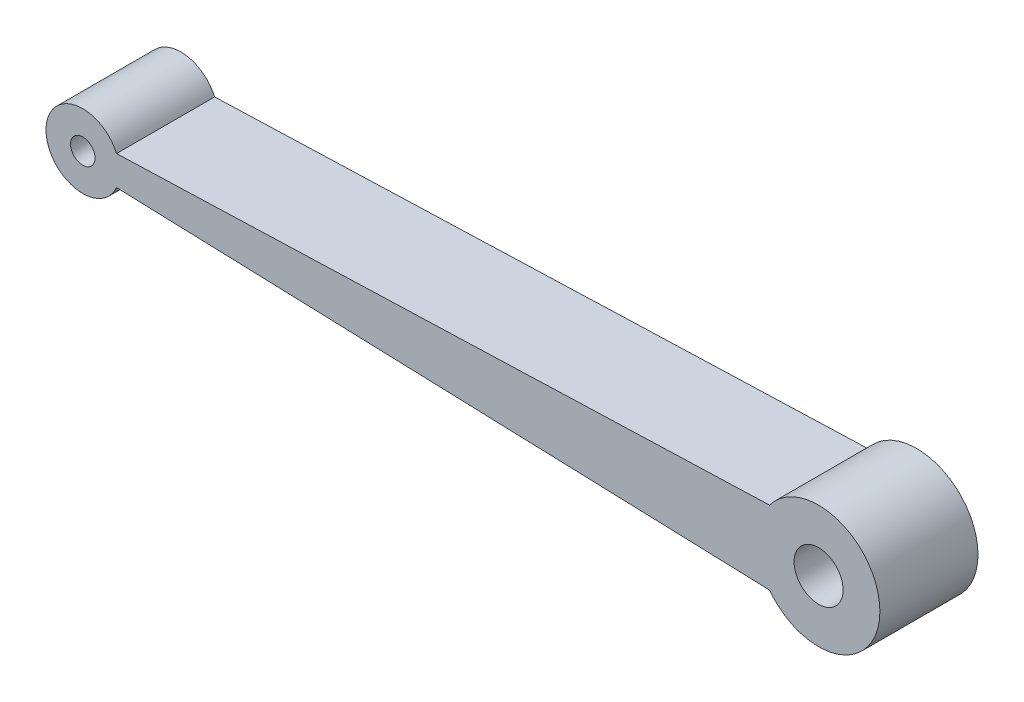
ISO-10303-21;
HEADER;
FILE_DESCRIPTION(('STEP AP214'),'2;1');
FILE_NAME('part.step','',(''),(''),'','','');
FILE_SCHEMA(('AUTOMOTIVE_DESIGN { 1 0 10303 214 1 1 1 1 }'));
ENDSEC;
DATA;
#1=APPLICATION_CONTEXT('core data for automotive mechanical design processes');
#2=APPLICATION_PROTOCOL_DEFINITION('international standard','automotive_design',2000,#1);
#3=PRODUCT_CONTEXT('',#1,'mechanical');
#4=PRODUCT('Part','Part','',(#3));
#5=PRODUCT_RELATED_PRODUCT_CATEGORY('part','',(#4));
#6=PRODUCT_DEFINITION_FORMATION('','',#4);
#7=PRODUCT_DEFINITION_CONTEXT('part definition',#1,'design');
#8=PRODUCT_DEFINITION('design','',#6,#7);
#9=PRODUCT_DEFINITION_SHAPE('','',#8);
#10=(LENGTH_UNIT() NAMED_UNIT(*) SI_UNIT(.MILLI.,.METRE.));
#11=(NAMED_UNIT(*) PLANE_ANGLE_UNIT() SI_UNIT($,.RADIAN.));
#12=(NAMED_UNIT(*) SI_UNIT($,.STERADIAN.) SOLID_ANGLE_UNIT());
#13=UNCERTAINTY_MEASURE_WITH_UNIT(LENGTH_MEASURE(1.E-05),#10,'distance_accuracy_value','');
#14=(GEOMETRIC_REPRESENTATION_CONTEXT(3) GLOBAL_UNCERTAINTY_ASSIGNED_CONTEXT((#13)) GLOBAL_UNIT_ASSIGNED_CONTEXT((#10,
#11,#12)) REPRESENTATION_CONTEXT('',''));
#15=CARTESIAN_POINT('',(0.,0.,0.));
#16=DIRECTION('',(0.,0.,1.));
#17=DIRECTION('',(1.,0.,0.));
#18=AXIS2_PLACEMENT_3D('',#15,#16,#17);
#19=CARTESIAN_POINT('',(0.,0.,10.));
#20=DIRECTION('',(0.,0.,1.));
#21=DIRECTION('',(1.,0.,0.));
#22=AXIS2_PLACEMENT_3D('',#19,#20,#21);
#23=PLANE('',#22);
#24=CARTESIAN_POINT('',(0.,0.,10.));
#25=DIRECTION('',(0.,0.,1.));
#26=DIRECTION('',(1.,0.,0.));
#27=AXIS2_PLACEMENT_3D('',#24,#25,#26);
#28=CIRCLE('',#27,2.5);
#29=CARTESIAN_POINT('',(2.5,0.,10.));
#30=VERTEX_POINT('',#29);
#31=EDGE_CURVE('E108',#30,#30,#28,.T.);
#32=ORIENTED_EDGE('',*,*,#31,.F.);
#33=EDGE_LOOP('',(#32));
#34=FACE_BOUND('',#33,.T.);
#35=CARTESIAN_POINT('',(0.,0.,10.));
#36=DIRECTION('',(0.,0.,1.));
#37=DIRECTION('',(1.,0.,0.));
#38=AXIS2_PLACEMENT_3D('',#35,#36,#37);
#39=CIRCLE('',#38,7.5);
#40=CARTESIAN_POINT('',(6.87386354243376,3.,10.));
#41=VERTEX_POINT('',#40);
#42=CARTESIAN_POINT('',(6.87386354243376,-3.,10.));
#43=VERTEX_POINT('',#42);
#44=EDGE_CURVE('E93',#41,#43,#39,.T.);
#45=ORIENTED_EDGE('',*,*,#44,.T.);
#46=DIRECTION('',(0.999429183658203,-0.0337832333014146,0.));
#47=VECTOR('',#46,1.);
#48=CARTESIAN_POINT('',(6.87386354243376,-3.,10.));
#49=LINE('',#48,#47);
#50=CARTESIAN_POINT('',(140.,-7.5,10.));
#51=VERTEX_POINT('',#50);
#52=EDGE_CURVE('E88',#43,#51,#49,.T.);
#53=ORIENTED_EDGE('',*,*,#52,.T.);
#54=CARTESIAN_POINT('',(150.,0.,10.));
#55=DIRECTION('',(0.,0.,1.));
#56=DIRECTION('',(1.,0.,0.));
#57=AXIS2_PLACEMENT_3D('',#54,#55,#56);
#58=CIRCLE('',#57,12.5);
#59=CARTESIAN_POINT('',(140.,7.5,10.));
#60=VERTEX_POINT('',#59);
#61=EDGE_CURVE('E91',#51,#60,#58,.T.);
#62=ORIENTED_EDGE('',*,*,#61,.T.);
#63=DIRECTION('',(-0.999429183658203,-0.0337832333014146,0.));
#64=VECTOR('',#63,1.);
#65=CARTESIAN_POINT('',(6.87386354243376,3.,10.));
#66=LINE('',#65,#64);
#67=EDGE_CURVE('E58',#60,#41,#66,.T.);
#68=ORIENTED_EDGE('',*,*,#67,.T.);
#69=EDGE_LOOP('',(#45,#53,#62,#68));
#70=FACE_BOUND('',#69,.T.);
#71=CARTESIAN_POINT('',(150.,0.,10.));
#72=DIRECTION('',(0.,0.,1.));
#73=DIRECTION('',(1.,0.,0.));
#74=AXIS2_PLACEMENT_3D('',#71,#72,#73);
#75=CIRCLE('',#74,5.00000000000002);
#76=CARTESIAN_POINT('',(155.,0.,10.));
#77=VERTEX_POINT('',#76);
#78=EDGE_CURVE('E123',#77,#77,#75,.T.);
#79=ORIENTED_EDGE('',*,*,#78,.F.);
#80=EDGE_LOOP('',(#79));
#81=FACE_BOUND('',#80,.T.);
#82=ADVANCED_FACE('F41',(#34,#70,#81),#23,.T.);
#83=CARTESIAN_POINT('',(0.,0.,-10.));
#84=DIRECTION('',(0.,0.,1.));
#85=DIRECTION('',(1.,0.,0.));
#86=AXIS2_PLACEMENT_3D('',#83,#84,#85);
#87=PLANE('',#86);
#88=CARTESIAN_POINT('',(0.,0.,-10.));
#89=DIRECTION('',(0.,0.,1.));
#90=DIRECTION('',(1.,0.,0.));
#91=AXIS2_PLACEMENT_3D('',#88,#89,#90);
#92=CIRCLE('',#91,7.5);
#93=CARTESIAN_POINT('',(6.87386354243376,3.,-10.));
#94=VERTEX_POINT('',#93);
#95=CARTESIAN_POINT('',(6.87386354243376,-3.,-10.));
#96=VERTEX_POINT('',#95);
#97=EDGE_CURVE('E105',#94,#96,#92,.T.);
#98=ORIENTED_EDGE('',*,*,#97,.F.);
#99=DIRECTION('',(-0.999429183658203,-0.0337832333014146,0.));
#100=VECTOR('',#99,1.);
#101=CARTESIAN_POINT('',(6.87386354243376,3.,-10.));
#102=LINE('',#101,#100);
#103=CARTESIAN_POINT('',(140.,7.5,-10.));
#104=VERTEX_POINT('',#103);
#105=EDGE_CURVE('E81',#104,#94,#102,.T.);
#106=ORIENTED_EDGE('',*,*,#105,.F.);
#107=CARTESIAN_POINT('',(150.,0.,-10.));
#108=DIRECTION('',(0.,0.,1.));
#109=DIRECTION('',(1.,0.,0.));
#110=AXIS2_PLACEMENT_3D('',#107,#108,#109);
#111=CIRCLE('',#110,12.5);
#112=CARTESIAN_POINT('',(140.,-7.5,-10.));
#113=VERTEX_POINT('',#112);
#114=EDGE_CURVE('E75',#113,#104,#111,.T.);
#115=ORIENTED_EDGE('',*,*,#114,.F.);
#116=DIRECTION('',(0.999429183658203,-0.0337832333014146,0.));
#117=VECTOR('',#116,1.);
#118=CARTESIAN_POINT('',(6.87386354243376,-3.,-10.));
#119=LINE('',#118,#117);
#120=EDGE_CURVE('E97',#96,#113,#119,.T.);
#121=ORIENTED_EDGE('',*,*,#120,.F.);
#122=EDGE_LOOP('',(#98,#106,#115,#121));
#123=FACE_BOUND('',#122,.T.);
#124=CARTESIAN_POINT('',(0.,0.,-10.));
#125=DIRECTION('',(0.,0.,1.));
#126=DIRECTION('',(1.,0.,0.));
#127=AXIS2_PLACEMENT_3D('',#124,#125,#126);
#128=CIRCLE('',#127,2.5);
#129=CARTESIAN_POINT('',(2.5,0.,-10.));
#130=VERTEX_POINT('',#129);
#131=EDGE_CURVE('E120',#130,#130,#128,.T.);
#132=ORIENTED_EDGE('',*,*,#131,.T.);
#133=EDGE_LOOP('',(#132));
#134=FACE_BOUND('',#133,.T.);
#135=CARTESIAN_POINT('',(150.,0.,-10.));
#136=DIRECTION('',(0.,0.,1.));
#137=DIRECTION('',(1.,0.,0.));
#138=AXIS2_PLACEMENT_3D('',#135,#136,#137);
#139=CIRCLE('',#138,5.00000000000002);
#140=CARTESIAN_POINT('',(155.,0.,-10.));
#141=VERTEX_POINT('',#140);
#142=EDGE_CURVE('E126',#141,#141,#139,.T.);
#143=ORIENTED_EDGE('',*,*,#142,.T.);
#144=EDGE_LOOP('',(#143));
#145=FACE_BOUND('',#144,.T.);
#146=ADVANCED_FACE('F116',(#123,#134,#145),#87,.F.);
#147=CARTESIAN_POINT('',(0.,0.,10.));
#148=DIRECTION('',(0.,0.,-1.));
#149=DIRECTION('',(-1.,0.,0.));
#150=AXIS2_PLACEMENT_3D('',#147,#148,#149);
#151=CYLINDRICAL_SURFACE('',#150,7.5);
#152=ORIENTED_EDGE('',*,*,#97,.T.);
#153=DIRECTION('',(0.,0.,-1.));
#154=VECTOR('',#153,1.);
#155=CARTESIAN_POINT('',(6.87386354243376,-3.,10.));
#156=LINE('',#155,#154);
#157=EDGE_CURVE('E11',#43,#96,#156,.T.);
#158=ORIENTED_EDGE('',*,*,#157,.F.);
#159=ORIENTED_EDGE('',*,*,#44,.F.);
#160=DIRECTION('',(0.,0.,-1.));
#161=VECTOR('',#160,1.);
#162=CARTESIAN_POINT('',(6.87386354243376,3.,10.));
#163=LINE('',#162,#161);
#164=EDGE_CURVE('E101',#41,#94,#163,.T.);
#165=ORIENTED_EDGE('',*,*,#164,.T.);
#166=EDGE_LOOP('',(#152,#158,#159,#165));
#167=FACE_BOUND('',#166,.T.);
#168=ADVANCED_FACE('F43',(#167),#151,.T.);
#169=CARTESIAN_POINT('',(6.87386354243376,-3.,10.));
#170=DIRECTION('',(0.0337832333014146,0.999429183658203,0.));
#171=DIRECTION('',(-0.999429183658203,0.0337832333014146,0.));
#172=AXIS2_PLACEMENT_3D('',#169,#170,#171);
#173=PLANE('',#172);
#174=ORIENTED_EDGE('',*,*,#120,.T.);
#175=DIRECTION('',(0.,0.,-1.));
#176=VECTOR('',#175,1.);
#177=CARTESIAN_POINT('',(140.,-7.5,10.));
#178=LINE('',#177,#176);
#179=EDGE_CURVE('E50',#51,#113,#178,.T.);
#180=ORIENTED_EDGE('',*,*,#179,.F.);
#181=ORIENTED_EDGE('',*,*,#52,.F.);
#182=ORIENTED_EDGE('',*,*,#157,.T.);
#183=EDGE_LOOP('',(#174,#180,#181,#182));
#184=FACE_BOUND('',#183,.T.);
#185=ADVANCED_FACE('F96',(#184),#173,.F.);
#186=CARTESIAN_POINT('',(150.,0.,10.));
#187=DIRECTION('',(0.,0.,-1.));
#188=DIRECTION('',(-1.,0.,0.));
#189=AXIS2_PLACEMENT_3D('',#186,#187,#188);
#190=CYLINDRICAL_SURFACE('',#189,12.5);
#191=ORIENTED_EDGE('',*,*,#114,.T.);
#192=DIRECTION('',(0.,0.,-1.));
#193=VECTOR('',#192,1.);
#194=CARTESIAN_POINT('',(140.,7.5,10.));
#195=LINE('',#194,#193);
#196=EDGE_CURVE('E98',#60,#104,#195,.T.);
#197=ORIENTED_EDGE('',*,*,#196,.F.);
#198=ORIENTED_EDGE('',*,*,#61,.F.);
#199=ORIENTED_EDGE('',*,*,#179,.T.);
#200=EDGE_LOOP('',(#191,#197,#198,#199));
#201=FACE_BOUND('',#200,.T.);
#202=ADVANCED_FACE('F99',(#201),#190,.T.);
#203=CARTESIAN_POINT('',(6.87386354243376,3.,10.));
#204=DIRECTION('',(0.0337832333014146,-0.999429183658203,0.));
#205=DIRECTION('',(0.999429183658203,0.0337832333014146,0.));
#206=AXIS2_PLACEMENT_3D('',#203,#204,#205);
#207=PLANE('',#206);
#208=ORIENTED_EDGE('',*,*,#105,.T.);
#209=ORIENTED_EDGE('',*,*,#164,.F.);
#210=ORIENTED_EDGE('',*,*,#67,.F.);
#211=ORIENTED_EDGE('',*,*,#196,.T.);
#212=EDGE_LOOP('',(#208,#209,#210,#211));
#213=FACE_BOUND('',#212,.T.);
#214=ADVANCED_FACE('F113',(#213),#207,.F.);
#215=CARTESIAN_POINT('',(0.,0.,10.));
#216=DIRECTION('',(0.,0.,-1.));
#217=DIRECTION('',(-1.,0.,0.));
#218=AXIS2_PLACEMENT_3D('',#215,#216,#217);
#219=CYLINDRICAL_SURFACE('',#218,2.5);
#220=ORIENTED_EDGE('',*,*,#31,.T.);
#221=EDGE_LOOP('',(#220));
#222=FACE_BOUND('',#221,.T.);
#223=ORIENTED_EDGE('',*,*,#131,.F.);
#224=EDGE_LOOP('',(#223));
#225=FACE_BOUND('',#224,.T.);
#226=ADVANCED_FACE('F143',(#222,#225),#219,.F.);
#227=CARTESIAN_POINT('',(150.,0.,10.));
#228=DIRECTION('',(0.,0.,-1.));
#229=DIRECTION('',(-1.,0.,0.));
#230=AXIS2_PLACEMENT_3D('',#227,#228,#229);
#231=CYLINDRICAL_SURFACE('',#230,5.00000000000002);
#232=ORIENTED_EDGE('',*,*,#78,.T.);
#233=EDGE_LOOP('',(#232));
#234=FACE_BOUND('',#233,.T.);
#235=ORIENTED_EDGE('',*,*,#142,.F.);
#236=EDGE_LOOP('',(#235));
#237=FACE_BOUND('',#236,.T.);
#238=ADVANCED_FACE('F132',(#234,#237),#231,.F.);
#239=CLOSED_SHELL('',(#82,#146,#168,#185,#202,#214,#226,#238));
#240=MANIFOLD_SOLID_BREP('B2',#239);
#241=ADVANCED_BREP_SHAPE_REPRESENTATION('',(#18,#240),#14);
#242=SHAPE_DEFINITION_REPRESENTATION(#9,#241);
ENDSEC;
END-ISO-10303-21;
